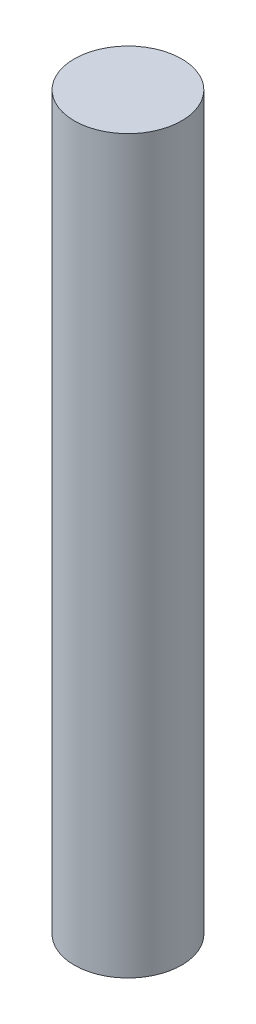
ISO-10303-21;
HEADER;
FILE_DESCRIPTION(('STEP AP214'),'2;1');
FILE_NAME('part.step','',(''),(''),'','','');
FILE_SCHEMA(('AUTOMOTIVE_DESIGN { 1 0 10303 214 1 1 1 1 }'));
ENDSEC;
DATA;
#1=APPLICATION_CONTEXT('core data for automotive mechanical design processes');
#2=APPLICATION_PROTOCOL_DEFINITION('international standard','automotive_design',2000,#1);
#3=PRODUCT_CONTEXT('',#1,'mechanical');
#4=PRODUCT('Part','Part','',(#3));
#5=PRODUCT_RELATED_PRODUCT_CATEGORY('part','',(#4));
#6=PRODUCT_DEFINITION_FORMATION('','',#4);
#7=PRODUCT_DEFINITION_CONTEXT('part definition',#1,'design');
#8=PRODUCT_DEFINITION('design','',#6,#7);
#9=PRODUCT_DEFINITION_SHAPE('','',#8);
#10=(LENGTH_UNIT() NAMED_UNIT(*) SI_UNIT(.MILLI.,.METRE.));
#11=(NAMED_UNIT(*) PLANE_ANGLE_UNIT() SI_UNIT($,.RADIAN.));
#12=(NAMED_UNIT(*) SI_UNIT($,.STERADIAN.) SOLID_ANGLE_UNIT());
#13=UNCERTAINTY_MEASURE_WITH_UNIT(LENGTH_MEASURE(1.E-05),#10,'distance_accuracy_value','');
#14=(GEOMETRIC_REPRESENTATION_CONTEXT(3) GLOBAL_UNCERTAINTY_ASSIGNED_CONTEXT((#13)) GLOBAL_UNIT_ASSIGNED_CONTEXT((#10,
#11,#12)) REPRESENTATION_CONTEXT('',''));
#15=CARTESIAN_POINT('',(0.,0.,0.));
#16=DIRECTION('',(0.,0.,1.));
#17=DIRECTION('',(1.,0.,0.));
#18=AXIS2_PLACEMENT_3D('',#15,#16,#17);
#19=CARTESIAN_POINT('',(0.,17.2974,0.));
#20=DIRECTION('',(0.,-1.,0.));
#21=DIRECTION('',(0.,0.,-1.));
#22=AXIS2_PLACEMENT_3D('',#19,#20,#21);
#23=CYLINDRICAL_SURFACE('',#22,1.27);
#24=CARTESIAN_POINT('',(0.,17.2974,0.));
#25=DIRECTION('',(0.,1.,0.));
#26=DIRECTION('',(0.,0.,1.));
#27=AXIS2_PLACEMENT_3D('',#24,#25,#26);
#28=CIRCLE('',#27,1.27);
#29=CARTESIAN_POINT('',(0.,17.2974,1.27));
#30=VERTEX_POINT('',#29);
#31=EDGE_CURVE('E10',#30,#30,#28,.T.);
#32=ORIENTED_EDGE('',*,*,#31,.F.);
#33=EDGE_LOOP('',(#32));
#34=FACE_BOUND('',#33,.T.);
#35=CARTESIAN_POINT('',(0.,0.,0.));
#36=DIRECTION('',(0.,1.,0.));
#37=DIRECTION('',(0.,0.,1.));
#38=AXIS2_PLACEMENT_3D('',#35,#36,#37);
#39=CIRCLE('',#38,1.27);
#40=CARTESIAN_POINT('',(0.,0.,1.27));
#41=VERTEX_POINT('',#40);
#42=EDGE_CURVE('E36',#41,#41,#39,.T.);
#43=ORIENTED_EDGE('',*,*,#42,.T.);
#44=EDGE_LOOP('',(#43));
#45=FACE_BOUND('',#44,.T.);
#46=ADVANCED_FACE('F33',(#34,#45),#23,.T.);
#47=CARTESIAN_POINT('',(0.,17.2974,0.));
#48=DIRECTION('',(0.,1.,0.));
#49=DIRECTION('',(0.,0.,1.));
#50=AXIS2_PLACEMENT_3D('',#47,#48,#49);
#51=PLANE('',#50);
#52=ORIENTED_EDGE('',*,*,#31,.T.);
#53=EDGE_LOOP('',(#52));
#54=FACE_BOUND('',#53,.T.);
#55=ADVANCED_FACE('F48',(#54),#51,.T.);
#56=CARTESIAN_POINT('',(0.,0.,0.));
#57=DIRECTION('',(0.,1.,0.));
#58=DIRECTION('',(0.,0.,1.));
#59=AXIS2_PLACEMENT_3D('',#56,#57,#58);
#60=PLANE('',#59);
#61=ORIENTED_EDGE('',*,*,#42,.F.);
#62=EDGE_LOOP('',(#61));
#63=FACE_BOUND('',#62,.T.);
#64=ADVANCED_FACE('F46',(#63),#60,.F.);
#65=CLOSED_SHELL('',(#46,#55,#64));
#66=MANIFOLD_SOLID_BREP('B2',#65);
#67=ADVANCED_BREP_SHAPE_REPRESENTATION('',(#18,#66),#14);
#68=SHAPE_DEFINITION_REPRESENTATION(#9,#67);
ENDSEC;
END-ISO-10303-21;
